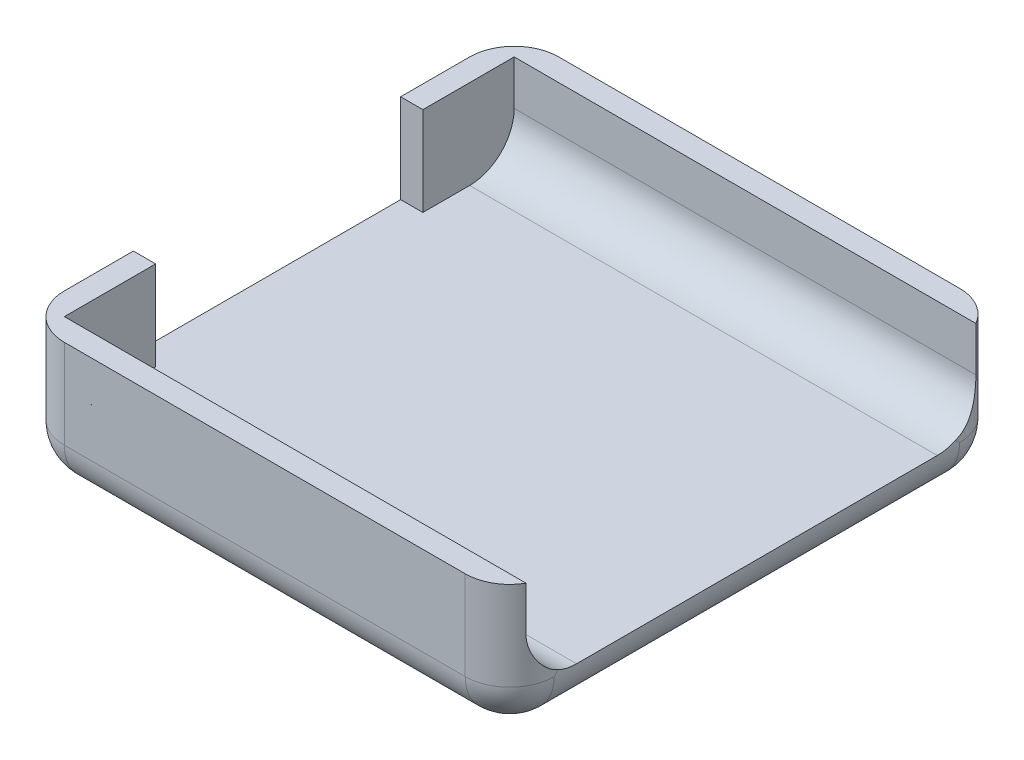
ISO-10303-21;
HEADER;
FILE_DESCRIPTION(('STEP AP214'),'2;1');
FILE_NAME('part.step','',(''),(''),'','','');
FILE_SCHEMA(('AUTOMOTIVE_DESIGN { 1 0 10303 214 1 1 1 1 }'));
ENDSEC;
DATA;
#1=APPLICATION_CONTEXT('core data for automotive mechanical design processes');
#2=APPLICATION_PROTOCOL_DEFINITION('international standard','automotive_design',2000,#1);
#3=PRODUCT_CONTEXT('',#1,'mechanical');
#4=PRODUCT('Part','Part','',(#3));
#5=PRODUCT_RELATED_PRODUCT_CATEGORY('part','',(#4));
#6=PRODUCT_DEFINITION_FORMATION('','',#4);
#7=PRODUCT_DEFINITION_CONTEXT('part definition',#1,'design');
#8=PRODUCT_DEFINITION('design','',#6,#7);
#9=PRODUCT_DEFINITION_SHAPE('','',#8);
#10=(LENGTH_UNIT() NAMED_UNIT(*) SI_UNIT(.MILLI.,.METRE.));
#11=(NAMED_UNIT(*) PLANE_ANGLE_UNIT() SI_UNIT($,.RADIAN.));
#12=(NAMED_UNIT(*) SI_UNIT($,.STERADIAN.) SOLID_ANGLE_UNIT());
#13=UNCERTAINTY_MEASURE_WITH_UNIT(LENGTH_MEASURE(1.E-05),#10,'distance_accuracy_value','');
#14=(GEOMETRIC_REPRESENTATION_CONTEXT(3) GLOBAL_UNCERTAINTY_ASSIGNED_CONTEXT((#13)) GLOBAL_UNIT_ASSIGNED_CONTEXT((#10,
#11,#12)) REPRESENTATION_CONTEXT('',''));
#15=CARTESIAN_POINT('',(0.,0.,0.));
#16=DIRECTION('',(0.,0.,1.));
#17=DIRECTION('',(1.,0.,0.));
#18=AXIS2_PLACEMENT_3D('',#15,#16,#17);
#19=CARTESIAN_POINT('',(-11.,6.,11.1));
#20=DIRECTION('',(1.,0.,0.));
#21=DIRECTION('',(0.,0.,-1.));
#22=AXIS2_PLACEMENT_3D('',#19,#20,#21);
#23=PLANE('',#22);
#24=DIRECTION('',(0.,-1.,0.));
#25=VECTOR('',#24,1.);
#26=CARTESIAN_POINT('',(-11.,2.,-6.));
#27=LINE('',#26,#25);
#28=CARTESIAN_POINT('',(-11.,6.,-6.));
#29=VERTEX_POINT('',#28);
#30=CARTESIAN_POINT('',(-11.,2.,-6.));
#31=VERTEX_POINT('',#30);
#32=EDGE_CURVE('E606',#29,#31,#27,.T.);
#33=ORIENTED_EDGE('',*,*,#32,.F.);
#34=DIRECTION('',(0.,0.,1.));
#35=VECTOR('',#34,1.);
#36=CARTESIAN_POINT('',(-11.,6.,11.1));
#37=LINE('',#36,#35);
#38=CARTESIAN_POINT('',(-11.,6.,-9.1));
#39=VERTEX_POINT('',#38);
#40=EDGE_CURVE('E544',#39,#29,#37,.T.);
#41=ORIENTED_EDGE('',*,*,#40,.F.);
#42=DIRECTION('',(0.,-1.,0.));
#43=VECTOR('',#42,1.);
#44=CARTESIAN_POINT('',(-11.,6.,-9.1));
#45=LINE('',#44,#43);
#46=CARTESIAN_POINT('',(-11.,2.,-9.1));
#47=VERTEX_POINT('',#46);
#48=EDGE_CURVE('E196',#39,#47,#45,.T.);
#49=ORIENTED_EDGE('',*,*,#48,.T.);
#50=DIRECTION('',(0.,0.,1.));
#51=VECTOR('',#50,1.);
#52=CARTESIAN_POINT('',(-11.,2.,11.1));
#53=LINE('',#52,#51);
#54=EDGE_CURVE('E516',#47,#31,#53,.T.);
#55=ORIENTED_EDGE('',*,*,#54,.T.);
#56=EDGE_LOOP('',(#33,#41,#49,#55));
#57=FACE_BOUND('',#56,.T.);
#58=ADVANCED_FACE('F39',(#57),#23,.F.);
#59=DIRECTION('',(0.,1.,0.));
#60=VECTOR('',#59,1.);
#61=CARTESIAN_POINT('',(-11.,2.,6.));
#62=LINE('',#61,#60);
#63=CARTESIAN_POINT('',(-11.,2.,6.));
#64=VERTEX_POINT('',#63);
#65=CARTESIAN_POINT('',(-11.,6.,6.));
#66=VERTEX_POINT('',#65);
#67=EDGE_CURVE('E618',#64,#66,#62,.T.);
#68=ORIENTED_EDGE('',*,*,#67,.F.);
#69=CARTESIAN_POINT('',(-11.,2.,9.1));
#70=VERTEX_POINT('',#69);
#71=EDGE_CURVE('E515',#64,#70,#53,.T.);
#72=ORIENTED_EDGE('',*,*,#71,.T.);
#73=DIRECTION('',(0.,-1.,0.));
#74=VECTOR('',#73,1.);
#75=CARTESIAN_POINT('',(-11.,6.,9.1));
#76=LINE('',#75,#74);
#77=CARTESIAN_POINT('',(-11.,6.,9.1));
#78=VERTEX_POINT('',#77);
#79=EDGE_CURVE('E518',#70,#78,#76,.F.);
#80=ORIENTED_EDGE('',*,*,#79,.T.);
#81=EDGE_CURVE('E192',#66,#78,#37,.T.);
#82=ORIENTED_EDGE('',*,*,#81,.F.);
#83=EDGE_LOOP('',(#68,#72,#80,#82));
#84=FACE_BOUND('',#83,.T.);
#85=ADVANCED_FACE('F328',(#84),#23,.F.);
#86=CARTESIAN_POINT('',(0.,6.,0.));
#87=DIRECTION('',(0.,-1.,0.));
#88=DIRECTION('',(0.,0.,-1.));
#89=AXIS2_PLACEMENT_3D('',#86,#87,#88);
#90=PLANE('',#89);
#91=DIRECTION('',(-1.,0.,0.));
#92=VECTOR('',#91,1.);
#93=CARTESIAN_POINT('',(-0.999999999999999,6.,-6.));
#94=LINE('',#93,#92);
#95=CARTESIAN_POINT('',(-10.,6.,-6.));
#96=VERTEX_POINT('',#95);
#97=EDGE_CURVE('E620',#96,#29,#94,.T.);
#98=ORIENTED_EDGE('',*,*,#97,.F.);
#99=DIRECTION('',(0.,0.,1.));
#100=VECTOR('',#99,1.);
#101=CARTESIAN_POINT('',(-10.,6.,10.1));
#102=LINE('',#101,#100);
#103=CARTESIAN_POINT('',(-10.,6.,-10.1));
#104=VERTEX_POINT('',#103);
#105=EDGE_CURVE('E632',#104,#96,#102,.T.);
#106=ORIENTED_EDGE('',*,*,#105,.F.);
#107=DIRECTION('',(-1.,0.,0.));
#108=VECTOR('',#107,1.);
#109=CARTESIAN_POINT('',(-10.,6.,-10.1));
#110=LINE('',#109,#108);
#111=CARTESIAN_POINT('',(10.7320508075689,6.,-10.1));
#112=VERTEX_POINT('',#111);
#113=EDGE_CURVE('E541',#112,#104,#110,.T.);
#114=ORIENTED_EDGE('',*,*,#113,.F.);
#115=CARTESIAN_POINT('',(9.,6.,-9.1));
#116=DIRECTION('',(0.,-1.,0.));
#117=DIRECTION('',(0.,0.,-1.));
#118=AXIS2_PLACEMENT_3D('',#115,#116,#117);
#119=CIRCLE('',#118,2.);
#120=CARTESIAN_POINT('',(9.,6.,-11.1));
#121=VERTEX_POINT('',#120);
#122=EDGE_CURVE('E195',#112,#121,#119,.F.);
#123=ORIENTED_EDGE('',*,*,#122,.T.);
#124=DIRECTION('',(-1.,0.,0.));
#125=VECTOR('',#124,1.);
#126=CARTESIAN_POINT('',(-11.,6.,-11.1));
#127=LINE('',#126,#125);
#128=CARTESIAN_POINT('',(-9.,6.,-11.1));
#129=VERTEX_POINT('',#128);
#130=EDGE_CURVE('E176',#121,#129,#127,.T.);
#131=ORIENTED_EDGE('',*,*,#130,.T.);
#132=CARTESIAN_POINT('',(-9.,6.,-9.1));
#133=DIRECTION('',(0.,-1.,0.));
#134=DIRECTION('',(0.,0.,-1.));
#135=AXIS2_PLACEMENT_3D('',#132,#133,#134);
#136=CIRCLE('',#135,2.);
#137=EDGE_CURVE('E189',#129,#39,#136,.F.);
#138=ORIENTED_EDGE('',*,*,#137,.T.);
#139=ORIENTED_EDGE('',*,*,#40,.T.);
#140=EDGE_LOOP('',(#98,#106,#114,#123,#131,#138,#139));
#141=FACE_BOUND('',#140,.T.);
#142=ADVANCED_FACE('F187',(#141),#90,.F.);
#143=CARTESIAN_POINT('',(-10.,2.,10.1));
#144=DIRECTION('',(-1.,0.,0.));
#145=DIRECTION('',(0.,0.,1.));
#146=AXIS2_PLACEMENT_3D('',#143,#144,#145);
#147=PLANE('',#146);
#148=ORIENTED_EDGE('',*,*,#105,.T.);
#149=DIRECTION('',(0.,-1.,0.));
#150=VECTOR('',#149,1.);
#151=CARTESIAN_POINT('',(-10.,2.,-6.));
#152=LINE('',#151,#150);
#153=CARTESIAN_POINT('',(-10.,2.,-6.));
#154=VERTEX_POINT('',#153);
#155=EDGE_CURVE('E216',#96,#154,#152,.T.);
#156=ORIENTED_EDGE('',*,*,#155,.T.);
#157=DIRECTION('',(0.,0.,1.));
#158=VECTOR('',#157,1.);
#159=CARTESIAN_POINT('',(-10.,2.,10.1));
#160=LINE('',#159,#158);
#161=CARTESIAN_POINT('',(-10.,2.,-8.09999999999999));
#162=VERTEX_POINT('',#161);
#163=EDGE_CURVE('E635',#162,#154,#160,.T.);
#164=ORIENTED_EDGE('',*,*,#163,.F.);
#165=CARTESIAN_POINT('',(-10.,4.,-8.09999999999999));
#166=DIRECTION('',(-1.,0.,0.));
#167=DIRECTION('',(0.,0.,1.));
#168=AXIS2_PLACEMENT_3D('',#165,#166,#167);
#169=CIRCLE('',#168,2.);
#170=CARTESIAN_POINT('',(-10.,4.,-10.1));
#171=VERTEX_POINT('',#170);
#172=EDGE_CURVE('E556',#162,#171,#169,.F.);
#173=ORIENTED_EDGE('',*,*,#172,.T.);
#174=DIRECTION('',(0.,1.,0.));
#175=VECTOR('',#174,1.);
#176=CARTESIAN_POINT('',(-10.,2.,-10.1));
#177=LINE('',#176,#175);
#178=EDGE_CURVE('E564',#171,#104,#177,.T.);
#179=ORIENTED_EDGE('',*,*,#178,.T.);
#180=EDGE_LOOP('',(#148,#156,#164,#173,#179));
#181=FACE_BOUND('',#180,.T.);
#182=ADVANCED_FACE('F323',(#181),#147,.F.);
#183=CARTESIAN_POINT('',(-10.,6.,6.));
#184=VERTEX_POINT('',#183);
#185=CARTESIAN_POINT('',(-10.,6.,10.1));
#186=VERTEX_POINT('',#185);
#187=EDGE_CURVE('E98',#184,#186,#102,.T.);
#188=ORIENTED_EDGE('',*,*,#187,.F.);
#189=DIRECTION('',(-1.,0.,0.));
#190=VECTOR('',#189,1.);
#191=CARTESIAN_POINT('',(-0.999999999999999,6.,6.));
#192=LINE('',#191,#190);
#193=EDGE_CURVE('E53',#184,#66,#192,.T.);
#194=ORIENTED_EDGE('',*,*,#193,.T.);
#195=ORIENTED_EDGE('',*,*,#81,.T.);
#196=CARTESIAN_POINT('',(-9.,6.,9.1));
#197=DIRECTION('',(0.,-1.,0.));
#198=DIRECTION('',(0.,0.,-1.));
#199=AXIS2_PLACEMENT_3D('',#196,#197,#198);
#200=CIRCLE('',#199,2.);
#201=CARTESIAN_POINT('',(-9.,6.,11.1));
#202=VERTEX_POINT('',#201);
#203=EDGE_CURVE('E199',#78,#202,#200,.F.);
#204=ORIENTED_EDGE('',*,*,#203,.T.);
#205=DIRECTION('',(1.,0.,0.));
#206=VECTOR('',#205,1.);
#207=CARTESIAN_POINT('',(-11.,6.,11.1));
#208=LINE('',#207,#206);
#209=CARTESIAN_POINT('',(9.,6.,11.1));
#210=VERTEX_POINT('',#209);
#211=EDGE_CURVE('E537',#202,#210,#208,.T.);
#212=ORIENTED_EDGE('',*,*,#211,.T.);
#213=CARTESIAN_POINT('',(9.,6.,9.1));
#214=DIRECTION('',(0.,-1.,0.));
#215=DIRECTION('',(0.,0.,-1.));
#216=AXIS2_PLACEMENT_3D('',#213,#214,#215);
#217=CIRCLE('',#216,2.);
#218=CARTESIAN_POINT('',(10.7320508075689,6.,10.1));
#219=VERTEX_POINT('',#218);
#220=EDGE_CURVE('E203',#210,#219,#217,.F.);
#221=ORIENTED_EDGE('',*,*,#220,.T.);
#222=DIRECTION('',(1.,0.,0.));
#223=VECTOR('',#222,1.);
#224=CARTESIAN_POINT('',(9.99999999999999,6.,10.1));
#225=LINE('',#224,#223);
#226=EDGE_CURVE('E501',#186,#219,#225,.T.);
#227=ORIENTED_EDGE('',*,*,#226,.F.);
#228=EDGE_LOOP('',(#188,#194,#195,#204,#212,#221,#227));
#229=FACE_BOUND('',#228,.T.);
#230=ADVANCED_FACE('F336',(#229),#90,.F.);
#231=CARTESIAN_POINT('',(-11.,6.,-11.1));
#232=DIRECTION('',(0.,0.,1.));
#233=DIRECTION('',(1.,0.,0.));
#234=AXIS2_PLACEMENT_3D('',#231,#232,#233);
#235=PLANE('',#234);
#236=ORIENTED_EDGE('',*,*,#130,.F.);
#237=DIRECTION('',(0.,-1.,0.));
#238=VECTOR('',#237,1.);
#239=CARTESIAN_POINT('',(9.,6.,-11.1));
#240=LINE('',#239,#238);
#241=CARTESIAN_POINT('',(9.,2.,-11.1));
#242=VERTEX_POINT('',#241);
#243=EDGE_CURVE('E62',#121,#242,#240,.T.);
#244=ORIENTED_EDGE('',*,*,#243,.T.);
#245=DIRECTION('',(-1.,0.,0.));
#246=VECTOR('',#245,1.);
#247=CARTESIAN_POINT('',(-11.,2.,-11.1));
#248=LINE('',#247,#246);
#249=CARTESIAN_POINT('',(-9.,2.,-11.1));
#250=VERTEX_POINT('',#249);
#251=EDGE_CURVE('E180',#242,#250,#248,.T.);
#252=ORIENTED_EDGE('',*,*,#251,.T.);
#253=DIRECTION('',(0.,-1.,0.));
#254=VECTOR('',#253,1.);
#255=CARTESIAN_POINT('',(-9.,6.,-11.1));
#256=LINE('',#255,#254);
#257=EDGE_CURVE('E173',#250,#129,#256,.F.);
#258=ORIENTED_EDGE('',*,*,#257,.T.);
#259=EDGE_LOOP('',(#236,#244,#252,#258));
#260=FACE_BOUND('',#259,.T.);
#261=ADVANCED_FACE('F174',(#260),#235,.F.);
#262=CARTESIAN_POINT('',(-11.,6.,11.1));
#263=DIRECTION('',(0.,0.,-1.));
#264=DIRECTION('',(-1.,0.,0.));
#265=AXIS2_PLACEMENT_3D('',#262,#263,#264);
#266=PLANE('',#265);
#267=DIRECTION('',(1.,0.,0.));
#268=VECTOR('',#267,1.);
#269=CARTESIAN_POINT('',(11.,2.,11.1));
#270=LINE('',#269,#268);
#271=CARTESIAN_POINT('',(-9.,2.,11.1));
#272=VERTEX_POINT('',#271);
#273=CARTESIAN_POINT('',(9.,2.,11.1));
#274=VERTEX_POINT('',#273);
#275=EDGE_CURVE('E531',#272,#274,#270,.T.);
#276=ORIENTED_EDGE('',*,*,#275,.T.);
#277=DIRECTION('',(0.,-1.,0.));
#278=VECTOR('',#277,1.);
#279=CARTESIAN_POINT('',(9.,6.,11.1));
#280=LINE('',#279,#278);
#281=EDGE_CURVE('E185',#274,#210,#280,.F.);
#282=ORIENTED_EDGE('',*,*,#281,.T.);
#283=ORIENTED_EDGE('',*,*,#211,.F.);
#284=DIRECTION('',(0.,-1.,0.));
#285=VECTOR('',#284,1.);
#286=CARTESIAN_POINT('',(-9.,6.,11.1));
#287=LINE('',#286,#285);
#288=EDGE_CURVE('E532',#202,#272,#287,.T.);
#289=ORIENTED_EDGE('',*,*,#288,.T.);
#290=EDGE_LOOP('',(#276,#282,#283,#289));
#291=FACE_BOUND('',#290,.T.);
#292=ADVANCED_FACE('F331',(#291),#266,.F.);
#293=CARTESIAN_POINT('',(0.,0.,0.));
#294=DIRECTION('',(0.,-1.,0.));
#295=DIRECTION('',(0.,0.,-1.));
#296=AXIS2_PLACEMENT_3D('',#293,#294,#295);
#297=PLANE('',#296);
#298=CARTESIAN_POINT('',(0.35,0.,0.));
#299=DIRECTION('',(0.,-1.,0.));
#300=DIRECTION('',(0.,0.,-1.));
#301=AXIS2_PLACEMENT_3D('',#298,#299,#300);
#302=CIRCLE('',#301,4.4);
#303=CARTESIAN_POINT('',(0.35,0.,-4.4));
#304=VERTEX_POINT('',#303);
#305=EDGE_CURVE('E11',#304,#304,#302,.F.);
#306=ORIENTED_EDGE('',*,*,#305,.T.);
#307=EDGE_LOOP('',(#306));
#308=FACE_BOUND('',#307,.T.);
#309=DIRECTION('',(1.,0.,0.));
#310=VECTOR('',#309,1.);
#311=CARTESIAN_POINT('',(-11.,0.,9.1));
#312=LINE('',#311,#310);
#313=CARTESIAN_POINT('',(9.,0.,9.1));
#314=VERTEX_POINT('',#313);
#315=CARTESIAN_POINT('',(-9.,0.,9.1));
#316=VERTEX_POINT('',#315);
#317=EDGE_CURVE('E528',#314,#316,#312,.F.);
#318=ORIENTED_EDGE('',*,*,#317,.T.);
#319=DIRECTION('',(0.,0.,1.));
#320=VECTOR('',#319,1.);
#321=CARTESIAN_POINT('',(-9.,0.,-11.1));
#322=LINE('',#321,#320);
#323=CARTESIAN_POINT('',(-9.,0.,-9.1));
#324=VERTEX_POINT('',#323);
#325=EDGE_CURVE('E527',#316,#324,#322,.F.);
#326=ORIENTED_EDGE('',*,*,#325,.T.);
#327=DIRECTION('',(-1.,0.,0.));
#328=VECTOR('',#327,1.);
#329=CARTESIAN_POINT('',(11.,0.,-9.1));
#330=LINE('',#329,#328);
#331=CARTESIAN_POINT('',(9.,0.,-9.1));
#332=VERTEX_POINT('',#331);
#333=EDGE_CURVE('E525',#324,#332,#330,.F.);
#334=ORIENTED_EDGE('',*,*,#333,.T.);
#335=DIRECTION('',(0.,0.,-1.));
#336=VECTOR('',#335,1.);
#337=CARTESIAN_POINT('',(9.,0.,11.1));
#338=LINE('',#337,#336);
#339=EDGE_CURVE('E524',#332,#314,#338,.F.);
#340=ORIENTED_EDGE('',*,*,#339,.T.);
#341=EDGE_LOOP('',(#318,#326,#334,#340));
#342=FACE_BOUND('',#341,.T.);
#343=ADVANCED_FACE('F345',(#308,#342),#297,.T.);
#344=CARTESIAN_POINT('',(9.99999999999999,2.,10.1));
#345=DIRECTION('',(0.,0.,1.));
#346=DIRECTION('',(1.,0.,0.));
#347=AXIS2_PLACEMENT_3D('',#344,#345,#346);
#348=PLANE('',#347);
#349=DIRECTION('',(0.,-1.,0.));
#350=VECTOR('',#349,1.);
#351=CARTESIAN_POINT('',(10.7320508075689,6.,10.1));
#352=LINE('',#351,#350);
#353=CARTESIAN_POINT('',(10.7320508075689,4.,10.1));
#354=VERTEX_POINT('',#353);
#355=EDGE_CURVE('E496',#219,#354,#352,.T.);
#356=ORIENTED_EDGE('',*,*,#355,.T.);
#357=DIRECTION('',(1.,0.,0.));
#358=VECTOR('',#357,1.);
#359=CARTESIAN_POINT('',(-10.,4.,10.1));
#360=LINE('',#359,#358);
#361=CARTESIAN_POINT('',(-10.,4.,10.1));
#362=VERTEX_POINT('',#361);
#363=EDGE_CURVE('E497',#354,#362,#360,.F.);
#364=ORIENTED_EDGE('',*,*,#363,.T.);
#365=DIRECTION('',(0.,1.,0.));
#366=VECTOR('',#365,1.);
#367=CARTESIAN_POINT('',(-10.,2.,10.1));
#368=LINE('',#367,#366);
#369=EDGE_CURVE('E193',#362,#186,#368,.T.);
#370=ORIENTED_EDGE('',*,*,#369,.T.);
#371=ORIENTED_EDGE('',*,*,#226,.T.);
#372=EDGE_LOOP('',(#356,#364,#370,#371));
#373=FACE_BOUND('',#372,.T.);
#374=ADVANCED_FACE('F430',(#373),#348,.F.);
#375=CARTESIAN_POINT('',(-10.,2.,-10.1));
#376=DIRECTION('',(0.,0.,-1.));
#377=DIRECTION('',(-1.,0.,0.));
#378=AXIS2_PLACEMENT_3D('',#375,#376,#377);
#379=PLANE('',#378);
#380=ORIENTED_EDGE('',*,*,#178,.F.);
#381=DIRECTION('',(-1.,0.,0.));
#382=VECTOR('',#381,1.);
#383=CARTESIAN_POINT('',(11.,4.,-10.1));
#384=LINE('',#383,#382);
#385=CARTESIAN_POINT('',(10.7320508075689,4.,-10.1));
#386=VERTEX_POINT('',#385);
#387=EDGE_CURVE('E503',#171,#386,#384,.F.);
#388=ORIENTED_EDGE('',*,*,#387,.T.);
#389=DIRECTION('',(0.,-1.,0.));
#390=VECTOR('',#389,1.);
#391=CARTESIAN_POINT('',(10.7320508075689,2.,-10.1));
#392=LINE('',#391,#390);
#393=EDGE_CURVE('E557',#386,#112,#392,.F.);
#394=ORIENTED_EDGE('',*,*,#393,.T.);
#395=ORIENTED_EDGE('',*,*,#113,.T.);
#396=EDGE_LOOP('',(#380,#388,#394,#395));
#397=FACE_BOUND('',#396,.T.);
#398=ADVANCED_FACE('F448',(#397),#379,.F.);
#399=CARTESIAN_POINT('',(0.,2.,0.));
#400=DIRECTION('',(0.,-1.,0.));
#401=DIRECTION('',(0.,0.,-1.));
#402=AXIS2_PLACEMENT_3D('',#399,#400,#401);
#403=PLANE('',#402);
#404=ORIENTED_EDGE('',*,*,#163,.T.);
#405=DIRECTION('',(-1.,0.,0.));
#406=VECTOR('',#405,1.);
#407=CARTESIAN_POINT('',(-0.999999999999999,2.,-6.));
#408=LINE('',#407,#406);
#409=EDGE_CURVE('E616',#154,#31,#408,.T.);
#410=ORIENTED_EDGE('',*,*,#409,.T.);
#411=DIRECTION('',(0.,0.,1.));
#412=VECTOR('',#411,1.);
#413=CARTESIAN_POINT('',(-11.,2.,-6.));
#414=LINE('',#413,#412);
#415=EDGE_CURVE('E613',#31,#64,#414,.T.);
#416=ORIENTED_EDGE('',*,*,#415,.T.);
#417=DIRECTION('',(-1.,0.,0.));
#418=VECTOR('',#417,1.);
#419=CARTESIAN_POINT('',(-0.999999999999999,2.,6.));
#420=LINE('',#419,#418);
#421=CARTESIAN_POINT('',(-10.,2.,6.));
#422=VERTEX_POINT('',#421);
#423=EDGE_CURVE('E624',#422,#64,#420,.T.);
#424=ORIENTED_EDGE('',*,*,#423,.F.);
#425=CARTESIAN_POINT('',(-10.,2.,8.1));
#426=VERTEX_POINT('',#425);
#427=EDGE_CURVE('E574',#422,#426,#160,.T.);
#428=ORIENTED_EDGE('',*,*,#427,.T.);
#429=DIRECTION('',(1.,0.,0.));
#430=VECTOR('',#429,1.);
#431=CARTESIAN_POINT('',(11.,2.,8.1));
#432=LINE('',#431,#430);
#433=CARTESIAN_POINT('',(11.,2.,8.1));
#434=VERTEX_POINT('',#433);
#435=EDGE_CURVE('E552',#426,#434,#432,.T.);
#436=ORIENTED_EDGE('',*,*,#435,.T.);
#437=DIRECTION('',(0.,0.,1.));
#438=VECTOR('',#437,1.);
#439=CARTESIAN_POINT('',(11.,2.,11.1));
#440=LINE('',#439,#438);
#441=CARTESIAN_POINT('',(11.,2.,-8.09999999999999));
#442=VERTEX_POINT('',#441);
#443=EDGE_CURVE('E548',#442,#434,#440,.T.);
#444=ORIENTED_EDGE('',*,*,#443,.F.);
#445=DIRECTION('',(-1.,0.,0.));
#446=VECTOR('',#445,1.);
#447=CARTESIAN_POINT('',(-10.,2.,-8.09999999999999));
#448=LINE('',#447,#446);
#449=EDGE_CURVE('E555',#442,#162,#448,.T.);
#450=ORIENTED_EDGE('',*,*,#449,.T.);
#451=EDGE_LOOP('',(#404,#410,#416,#424,#428,#436,#444,#450));
#452=FACE_BOUND('',#451,.T.);
#453=ADVANCED_FACE('F325',(#452),#403,.F.);
#454=ORIENTED_EDGE('',*,*,#427,.F.);
#455=DIRECTION('',(0.,1.,0.));
#456=VECTOR('',#455,1.);
#457=CARTESIAN_POINT('',(-10.,2.,6.));
#458=LINE('',#457,#456);
#459=EDGE_CURVE('E625',#422,#184,#458,.T.);
#460=ORIENTED_EDGE('',*,*,#459,.T.);
#461=ORIENTED_EDGE('',*,*,#187,.T.);
#462=ORIENTED_EDGE('',*,*,#369,.F.);
#463=CARTESIAN_POINT('',(-10.,4.,8.1));
#464=DIRECTION('',(-1.,0.,0.));
#465=DIRECTION('',(0.,0.,1.));
#466=AXIS2_PLACEMENT_3D('',#463,#464,#465);
#467=CIRCLE('',#466,2.);
#468=EDGE_CURVE('E509',#362,#426,#467,.F.);
#469=ORIENTED_EDGE('',*,*,#468,.T.);
#470=EDGE_LOOP('',(#454,#460,#461,#462,#469));
#471=FACE_BOUND('',#470,.T.);
#472=ADVANCED_FACE('F320',(#471),#147,.F.);
#473=CARTESIAN_POINT('',(-9.,6.,-9.1));
#474=DIRECTION('',(0.,-1.,0.));
#475=DIRECTION('',(0.,0.,-1.));
#476=AXIS2_PLACEMENT_3D('',#473,#474,#475);
#477=CYLINDRICAL_SURFACE('',#476,2.);
#478=ORIENTED_EDGE('',*,*,#137,.F.);
#479=ORIENTED_EDGE('',*,*,#257,.F.);
#480=CARTESIAN_POINT('',(-9.,2.,-9.1));
#481=DIRECTION('',(0.,-1.,0.));
#482=DIRECTION('',(0.,0.,-1.));
#483=AXIS2_PLACEMENT_3D('',#480,#481,#482);
#484=CIRCLE('',#483,2.);
#485=EDGE_CURVE('E598',#47,#250,#484,.T.);
#486=ORIENTED_EDGE('',*,*,#485,.F.);
#487=ORIENTED_EDGE('',*,*,#48,.F.);
#488=EDGE_LOOP('',(#478,#479,#486,#487));
#489=FACE_BOUND('',#488,.T.);
#490=ADVANCED_FACE('F200',(#489),#477,.T.);
#491=CARTESIAN_POINT('',(-9.,2.,11.1));
#492=DIRECTION('',(0.,0.,-1.));
#493=DIRECTION('',(-1.,0.,0.));
#494=AXIS2_PLACEMENT_3D('',#491,#492,#493);
#495=CYLINDRICAL_SURFACE('',#494,2.);
#496=CARTESIAN_POINT('',(-9.,2.,9.1));
#497=DIRECTION('',(0.,0.,1.));
#498=DIRECTION('',(1.,0.,0.));
#499=AXIS2_PLACEMENT_3D('',#496,#497,#498);
#500=CIRCLE('',#499,2.);
#501=EDGE_CURVE('E595',#70,#316,#500,.T.);
#502=ORIENTED_EDGE('',*,*,#501,.F.);
#503=ORIENTED_EDGE('',*,*,#71,.F.);
#504=ORIENTED_EDGE('',*,*,#415,.F.);
#505=ORIENTED_EDGE('',*,*,#54,.F.);
#506=CARTESIAN_POINT('',(-9.,2.,-9.1));
#507=DIRECTION('',(0.,0.,-1.));
#508=DIRECTION('',(-1.,0.,0.));
#509=AXIS2_PLACEMENT_3D('',#506,#507,#508);
#510=CIRCLE('',#509,2.);
#511=EDGE_CURVE('E600',#324,#47,#510,.T.);
#512=ORIENTED_EDGE('',*,*,#511,.F.);
#513=ORIENTED_EDGE('',*,*,#325,.F.);
#514=EDGE_LOOP('',(#502,#503,#504,#505,#512,#513));
#515=FACE_BOUND('',#514,.T.);
#516=ADVANCED_FACE('F315',(#515),#495,.T.);
#517=CARTESIAN_POINT('',(-9.,6.,9.1));
#518=DIRECTION('',(0.,-1.,0.));
#519=DIRECTION('',(0.,0.,-1.));
#520=AXIS2_PLACEMENT_3D('',#517,#518,#519);
#521=CYLINDRICAL_SURFACE('',#520,2.);
#522=ORIENTED_EDGE('',*,*,#203,.F.);
#523=ORIENTED_EDGE('',*,*,#79,.F.);
#524=CARTESIAN_POINT('',(-9.,2.,9.1));
#525=DIRECTION('',(0.,-1.,0.));
#526=DIRECTION('',(0.,0.,-1.));
#527=AXIS2_PLACEMENT_3D('',#524,#525,#526);
#528=CIRCLE('',#527,2.);
#529=EDGE_CURVE('E593',#272,#70,#528,.T.);
#530=ORIENTED_EDGE('',*,*,#529,.F.);
#531=ORIENTED_EDGE('',*,*,#288,.F.);
#532=EDGE_LOOP('',(#522,#523,#530,#531));
#533=FACE_BOUND('',#532,.T.);
#534=ADVANCED_FACE('F308',(#533),#521,.T.);
#535=CARTESIAN_POINT('',(-9.,2.,-9.1));
#536=DIRECTION('',(-1.,0.,0.));
#537=DIRECTION('',(0.,0.,1.));
#538=AXIS2_PLACEMENT_3D('',#535,#536,#537);
#539=SPHERICAL_SURFACE('',#538,2.);
#540=ORIENTED_EDGE('',*,*,#511,.T.);
#541=ORIENTED_EDGE('',*,*,#485,.T.);
#542=CARTESIAN_POINT('',(-9.,2.,-9.1));
#543=DIRECTION('',(-1.,0.,0.));
#544=DIRECTION('',(0.,0.,1.));
#545=AXIS2_PLACEMENT_3D('',#542,#543,#544);
#546=CIRCLE('',#545,2.);
#547=EDGE_CURVE('E586',#324,#250,#546,.F.);
#548=ORIENTED_EDGE('',*,*,#547,.F.);
#549=EDGE_LOOP('',(#540,#541,#548));
#550=FACE_BOUND('',#549,.T.);
#551=ADVANCED_FACE('F302',(#550),#539,.T.);
#552=CARTESIAN_POINT('',(-9.,2.,9.1));
#553=DIRECTION('',(-1.,0.,0.));
#554=DIRECTION('',(0.,0.,1.));
#555=AXIS2_PLACEMENT_3D('',#552,#553,#554);
#556=SPHERICAL_SURFACE('',#555,2.);
#557=ORIENTED_EDGE('',*,*,#529,.T.);
#558=ORIENTED_EDGE('',*,*,#501,.T.);
#559=CARTESIAN_POINT('',(-9.,2.,9.1));
#560=DIRECTION('',(-1.,0.,0.));
#561=DIRECTION('',(0.,0.,1.));
#562=AXIS2_PLACEMENT_3D('',#559,#560,#561);
#563=CIRCLE('',#562,2.);
#564=EDGE_CURVE('E582',#272,#316,#563,.F.);
#565=ORIENTED_EDGE('',*,*,#564,.F.);
#566=EDGE_LOOP('',(#557,#558,#565));
#567=FACE_BOUND('',#566,.T.);
#568=ADVANCED_FACE('F297',(#567),#556,.T.);
#569=CARTESIAN_POINT('',(-11.,2.,-9.1));
#570=DIRECTION('',(1.,0.,0.));
#571=DIRECTION('',(0.,0.,-1.));
#572=AXIS2_PLACEMENT_3D('',#569,#570,#571);
#573=CYLINDRICAL_SURFACE('',#572,2.);
#574=ORIENTED_EDGE('',*,*,#547,.T.);
#575=ORIENTED_EDGE('',*,*,#251,.F.);
#576=CARTESIAN_POINT('',(9.,2.,-9.1));
#577=DIRECTION('',(1.,0.,0.));
#578=DIRECTION('',(0.,0.,-1.));
#579=AXIS2_PLACEMENT_3D('',#576,#577,#578);
#580=CIRCLE('',#579,2.);
#581=EDGE_CURVE('E585',#332,#242,#580,.T.);
#582=ORIENTED_EDGE('',*,*,#581,.F.);
#583=ORIENTED_EDGE('',*,*,#333,.F.);
#584=EDGE_LOOP('',(#574,#575,#582,#583));
#585=FACE_BOUND('',#584,.T.);
#586=ADVANCED_FACE('F298',(#585),#573,.T.);
#587=CARTESIAN_POINT('',(-11.,2.,9.1));
#588=DIRECTION('',(-1.,0.,0.));
#589=DIRECTION('',(0.,0.,1.));
#590=AXIS2_PLACEMENT_3D('',#587,#588,#589);
#591=CYLINDRICAL_SURFACE('',#590,2.);
#592=ORIENTED_EDGE('',*,*,#564,.T.);
#593=ORIENTED_EDGE('',*,*,#317,.F.);
#594=CARTESIAN_POINT('',(9.,2.,9.1));
#595=DIRECTION('',(1.,0.,0.));
#596=DIRECTION('',(0.,0.,-1.));
#597=AXIS2_PLACEMENT_3D('',#594,#595,#596);
#598=CIRCLE('',#597,2.);
#599=EDGE_CURVE('E578',#274,#314,#598,.T.);
#600=ORIENTED_EDGE('',*,*,#599,.F.);
#601=ORIENTED_EDGE('',*,*,#275,.F.);
#602=EDGE_LOOP('',(#592,#593,#600,#601));
#603=FACE_BOUND('',#602,.T.);
#604=ADVANCED_FACE('F291',(#603),#591,.T.);
#605=CARTESIAN_POINT('',(9.,2.,-9.1));
#606=DIRECTION('',(0.,0.,-1.));
#607=DIRECTION('',(-1.,0.,0.));
#608=AXIS2_PLACEMENT_3D('',#605,#606,#607);
#609=SPHERICAL_SURFACE('',#608,2.);
#610=CARTESIAN_POINT('',(9.,2.,-9.1));
#611=DIRECTION('',(0.,0.,-1.));
#612=DIRECTION('',(-1.,0.,0.));
#613=AXIS2_PLACEMENT_3D('',#610,#611,#612);
#614=CIRCLE('',#613,2.);
#615=CARTESIAN_POINT('',(11.,2.,-9.1));
#616=VERTEX_POINT('',#615);
#617=EDGE_CURVE('E268',#332,#616,#614,.F.);
#618=ORIENTED_EDGE('',*,*,#617,.F.);
#619=ORIENTED_EDGE('',*,*,#581,.T.);
#620=CARTESIAN_POINT('',(9.,2.,-9.1));
#621=DIRECTION('',(0.,-1.,0.));
#622=DIRECTION('',(0.,0.,-1.));
#623=AXIS2_PLACEMENT_3D('',#620,#621,#622);
#624=CIRCLE('',#623,2.);
#625=EDGE_CURVE('E86',#616,#242,#624,.F.);
#626=ORIENTED_EDGE('',*,*,#625,.F.);
#627=EDGE_LOOP('',(#618,#619,#626));
#628=FACE_BOUND('',#627,.T.);
#629=ADVANCED_FACE('F290',(#628),#609,.T.);
#630=CARTESIAN_POINT('',(9.,2.,9.1));
#631=DIRECTION('',(1.,0.,0.));
#632=DIRECTION('',(0.,0.,-1.));
#633=AXIS2_PLACEMENT_3D('',#630,#631,#632);
#634=SPHERICAL_SURFACE('',#633,2.);
#635=CARTESIAN_POINT('',(9.,2.,9.1));
#636=DIRECTION('',(0.,-1.,0.));
#637=DIRECTION('',(0.,0.,-1.));
#638=AXIS2_PLACEMENT_3D('',#635,#636,#637);
#639=CIRCLE('',#638,2.);
#640=CARTESIAN_POINT('',(11.,2.,9.1));
#641=VERTEX_POINT('',#640);
#642=EDGE_CURVE('E278',#274,#641,#639,.F.);
#643=ORIENTED_EDGE('',*,*,#642,.F.);
#644=ORIENTED_EDGE('',*,*,#599,.T.);
#645=CARTESIAN_POINT('',(9.,2.,9.1));
#646=DIRECTION('',(0.,0.,1.));
#647=DIRECTION('',(1.,0.,0.));
#648=AXIS2_PLACEMENT_3D('',#645,#646,#647);
#649=CIRCLE('',#648,2.);
#650=EDGE_CURVE('E261',#641,#314,#649,.F.);
#651=ORIENTED_EDGE('',*,*,#650,.F.);
#652=EDGE_LOOP('',(#643,#644,#651));
#653=FACE_BOUND('',#652,.T.);
#654=ADVANCED_FACE('F282',(#653),#634,.T.);
#655=CARTESIAN_POINT('',(9.,6.,9.1));
#656=DIRECTION('',(0.,-1.,0.));
#657=DIRECTION('',(0.,0.,-1.));
#658=AXIS2_PLACEMENT_3D('',#655,#656,#657);
#659=CYLINDRICAL_SURFACE('',#658,2.);
#660=CARTESIAN_POINT('',(10.9921413018651,2.1771243444677,8.9228756555323));
#661=CARTESIAN_POINT('',(10.996236850495,2.19785901874959,8.96883937856044));
#662=CARTESIAN_POINT('',(10.9986501842268,2.22039991246175,9.01410829964845));
#663=CARTESIAN_POINT('',(11.0004868028149,2.26883902588533,9.10280505457347));
#664=CARTESIAN_POINT('',(10.9999139161348,2.29473290538849,9.14623517381395));
#665=CARTESIAN_POINT('',(10.996176458039,2.34945152785447,9.23057487564213));
#666=CARTESIAN_POINT('',(10.9930332132878,2.37825044976156,9.27150223163657));
#667=CARTESIAN_POINT('',(10.9845961603612,2.43871125967936,9.35094843705326));
#668=CARTESIAN_POINT('',(10.9793017144196,2.47037399455824,9.38946656830177));
#669=CARTESIAN_POINT('',(10.960882432998,2.5689853262127,9.50070323009242));
#670=CARTESIAN_POINT('',(10.9451916191636,2.63986508937262,9.56957583729261));
#671=CARTESIAN_POINT('',(10.9102798591065,2.79058875725233,9.69594741208142));
#672=CARTESIAN_POINT('',(10.8910484823157,2.87045887022528,9.75341170274045));
#673=CARTESIAN_POINT('',(10.8500736692483,3.04783131335305,9.86223220791242));
#674=CARTESIAN_POINT('',(10.8283068752149,3.14629851459999,9.91201705397737));
#675=CARTESIAN_POINT('',(10.7892333864489,3.35066415732796,9.99485210946569));
#676=CARTESIAN_POINT('',(10.7719153118788,3.45654273850367,10.0279452298313));
#677=CARTESIAN_POINT('',(10.750271880559,3.63586867023354,10.0679174636568));
#678=CARTESIAN_POINT('',(10.7435253189019,3.70790255497362,10.0799015043628));
#679=CARTESIAN_POINT('',(10.7366876715315,3.81687644412742,10.0919355005661));
#680=CARTESIAN_POINT('',(10.7349553815917,3.85340264753188,10.0949565330929));
#681=CARTESIAN_POINT('',(10.73263419093,3.92661659687401,10.0989899448158));
#682=CARTESIAN_POINT('',(10.7320457541188,3.96330440230904,10.1000015090386));
#683=CARTESIAN_POINT('',(10.7320508075689,4.,10.1));
#684=B_SPLINE_CURVE_WITH_KNOTS('',3,(#660,#661,#662,#663,#664,#665,#666,#667,#668,#669,#670,
#671,#672,#673,#674,#675,#676,#677,#678,#679,#680,#681,#682,#683),.UNSPECIFIED.,.F.,.F.,(4,2,2,
2,2,2,2,2,2,2,2,4),(0.,0.151666695564561,0.303138995734613,0.453367107463802,0.603639789832957,
0.90251327484491,1.20228176143518,1.5381866094878,1.87322345785697,2.09267224506773,
2.20268090551557,2.31273417269934),.UNSPECIFIED.);
#685=CARTESIAN_POINT('',(10.9921413018651,2.1771243444677,8.9228756555323));
#686=VERTEX_POINT('',#685);
#687=EDGE_CURVE('E275',#354,#686,#684,.F.);
#688=ORIENTED_EDGE('',*,*,#687,.F.);
#689=ORIENTED_EDGE('',*,*,#355,.F.);
#690=ORIENTED_EDGE('',*,*,#220,.F.);
#691=ORIENTED_EDGE('',*,*,#281,.F.);
#692=ORIENTED_EDGE('',*,*,#642,.T.);
#693=CARTESIAN_POINT('',(9.,2.,9.1));
#694=DIRECTION('',(0.,0.707106781186547,0.707106781186547));
#695=DIRECTION('',(0.,-0.707106781186547,0.707106781186547));
#696=AXIS2_PLACEMENT_3D('',#693,#694,#695);
#697=ELLIPSE('',#696,2.82842712474619,2.);
#698=EDGE_CURVE('E258',#686,#641,#697,.F.);
#699=ORIENTED_EDGE('',*,*,#698,.F.);
#700=EDGE_LOOP('',(#688,#689,#690,#691,#692,#699));
#701=FACE_BOUND('',#700,.T.);
#702=ADVANCED_FACE('F250',(#701),#659,.T.);
#703=CARTESIAN_POINT('',(0.,4.,8.1));
#704=DIRECTION('',(-1.,0.,0.));
#705=DIRECTION('',(0.,0.,1.));
#706=AXIS2_PLACEMENT_3D('',#703,#704,#705);
#707=CYLINDRICAL_SURFACE('',#706,2.);
#708=ORIENTED_EDGE('',*,*,#363,.F.);
#709=ORIENTED_EDGE('',*,*,#687,.T.);
#710=CARTESIAN_POINT('',(11.,2.,8.1));
#711=CARTESIAN_POINT('',(10.9999817966539,1.99999354724047,8.15646896756199));
#712=CARTESIAN_POINT('',(10.9999994074307,2.0023912226692,8.2129384169372));
#713=CARTESIAN_POINT('',(10.9999748787588,2.01195263448665,8.32550670957099));
#714=CARTESIAN_POINT('',(10.999932703371,2.01911923624187,8.38160530953002));
#715=CARTESIAN_POINT('',(10.9996593610908,2.03800818226048,8.49200935450489));
#716=CARTESIAN_POINT('',(10.9994315399642,2.04964796268016,8.54632897573337));
#717=CARTESIAN_POINT('',(10.9985504073155,2.0773967104592,8.65377953826732));
#718=CARTESIAN_POINT('',(10.9978973851652,2.0935026340937,8.70691126258263));
#719=CARTESIAN_POINT('',(10.9963327490961,2.12144289336573,8.78693749550393));
#720=CARTESIAN_POINT('',(10.9956881599894,2.13171168775857,8.8143930930728));
#721=CARTESIAN_POINT('',(10.9941310951834,2.15349404502453,8.86894893454236));
#722=CARTESIAN_POINT('',(10.993217366662,2.16501326652304,8.89604688303022));
#723=CARTESIAN_POINT('',(10.9921413018651,2.1771243444677,8.9228756555323));
#724=B_SPLINE_CURVE_WITH_KNOTS('',3,(#710,#711,#712,#713,#714,#715,#716,#717,#718,#719,#720,
#721,#722,#723),.UNSPECIFIED.,.F.,.F.,(4,2,2,2,2,2,4),(0.,0.169357509793954,0.33881686851445,
0.505288003158942,0.671645963580558,0.759580611797682,0.847931237886468),.UNSPECIFIED.);
#725=EDGE_CURVE('E255',#434,#686,#724,.T.);
#726=ORIENTED_EDGE('',*,*,#725,.F.);
#727=ORIENTED_EDGE('',*,*,#435,.F.);
#728=ORIENTED_EDGE('',*,*,#468,.F.);
#729=EDGE_LOOP('',(#708,#709,#726,#727,#728));
#730=FACE_BOUND('',#729,.T.);
#731=ADVANCED_FACE('F238',(#730),#707,.F.);
#732=CARTESIAN_POINT('',(9.,6.,-9.1));
#733=DIRECTION('',(0.,-1.,0.));
#734=DIRECTION('',(0.,0.,-1.));
#735=AXIS2_PLACEMENT_3D('',#732,#733,#734);
#736=CYLINDRICAL_SURFACE('',#735,2.);
#737=CARTESIAN_POINT('',(9.,2.,-9.1));
#738=DIRECTION('',(0.,-0.707106781186547,0.707106781186547));
#739=DIRECTION('',(0.,-0.707106781186547,-0.707106781186547));
#740=AXIS2_PLACEMENT_3D('',#737,#738,#739);
#741=ELLIPSE('',#740,2.82842712474619,2.);
#742=CARTESIAN_POINT('',(10.9921413018651,2.17712434446771,-8.92287565553231));
#743=VERTEX_POINT('',#742);
#744=EDGE_CURVE('E270',#616,#743,#741,.T.);
#745=ORIENTED_EDGE('',*,*,#744,.F.);
#746=ORIENTED_EDGE('',*,*,#625,.T.);
#747=ORIENTED_EDGE('',*,*,#243,.F.);
#748=ORIENTED_EDGE('',*,*,#122,.F.);
#749=ORIENTED_EDGE('',*,*,#393,.F.);
#750=CARTESIAN_POINT('',(10.7320508075689,4.,-10.1));
#751=CARTESIAN_POINT('',(10.7320237178578,3.94645160487867,-10.1000099020265));
#752=CARTESIAN_POINT('',(10.7332918537236,3.89291592615685,-10.0978498438998));
#753=CARTESIAN_POINT('',(10.7382142173798,3.7863430732424,-10.0892700729631));
#754=CARTESIAN_POINT('',(10.7418663467883,3.73330550222354,-10.0828541061073));
#755=CARTESIAN_POINT('',(10.7513219484809,3.62845066870783,-10.0658982159464));
#756=CARTESIAN_POINT('',(10.7571111794138,3.57662769021938,-10.0553855671306));
#757=CARTESIAN_POINT('',(10.7704856301971,3.47419841359246,-10.0303664728046));
#758=CARTESIAN_POINT('',(10.7780711874378,3.42359234598638,-10.0158592769456));
#759=CARTESIAN_POINT('',(10.802847349804,3.27437988146431,-9.96665670992374));
#760=CARTESIAN_POINT('',(10.8221018917188,3.17795288757261,-9.9262100418114));
#761=CARTESIAN_POINT('',(10.8623679783827,2.99263118300329,-9.83092891763189));
#762=CARTESIAN_POINT('',(10.8833844522101,2.90375910575591,-9.77605311411785));
#763=CARTESIAN_POINT('',(10.9249325456131,2.72777082397979,-9.64736661077389));
#764=CARTESIAN_POINT('',(10.9452557481362,2.64150983026266,-9.57230800180974));
#765=CARTESIAN_POINT('',(10.9779333580926,2.48256737022355,-9.40781226323665));
#766=CARTESIAN_POINT('',(10.9903192099803,2.40983314026738,-9.31843364612433));
#767=CARTESIAN_POINT('',(10.9991305050079,2.31299576023793,-9.17578785798317));
#768=CARTESIAN_POINT('',(11.0004445836627,2.28279392431532,-9.12688306753376));
#769=CARTESIAN_POINT('',(10.9992848357667,2.22665635865023,-9.02659146043892));
#770=CARTESIAN_POINT('',(10.9968026582464,2.2007301735263,-8.97519941333242));
#771=CARTESIAN_POINT('',(10.9921413018651,2.17712434446771,-8.92287565553231));
#772=B_SPLINE_CURVE_WITH_KNOTS('',3,(#750,#751,#752,#753,#754,#755,#756,#757,#758,#759,#760,
#761,#762,#763,#764,#765,#766,#767,#768,#769,#770,#771),.UNSPECIFIED.,.F.,.F.,(4,2,2,2,2,2,2,2,
2,2,4),(0.,0.160565954713904,0.32099077011812,0.480365286634599,0.639769761030244,
0.957291671602681,1.27573356604999,1.62242574426234,1.9677358415376,2.13991584357466,
2.31247515075145),.UNSPECIFIED.);
#773=EDGE_CURVE('E220',#743,#386,#772,.F.);
#774=ORIENTED_EDGE('',*,*,#773,.F.);
#775=EDGE_LOOP('',(#745,#746,#747,#748,#749,#774));
#776=FACE_BOUND('',#775,.T.);
#777=ADVANCED_FACE('F235',(#776),#736,.T.);
#778=CARTESIAN_POINT('',(9.,2.,11.1));
#779=DIRECTION('',(0.,0.,1.));
#780=DIRECTION('',(1.,0.,0.));
#781=AXIS2_PLACEMENT_3D('',#778,#779,#780);
#782=CYLINDRICAL_SURFACE('',#781,2.);
#783=ORIENTED_EDGE('',*,*,#617,.T.);
#784=ORIENTED_EDGE('',*,*,#744,.T.);
#785=CARTESIAN_POINT('',(10.9921413018651,2.17712434446771,-8.92287565553231));
#786=CARTESIAN_POINT('',(10.9941917948374,2.15389714757956,-8.87143942687484));
#787=CARTESIAN_POINT('',(10.9956673971439,2.13285392401687,-8.81900032789987));
#788=CARTESIAN_POINT('',(10.9978228252096,2.09525979197218,-8.71249276407795));
#789=CARTESIAN_POINT('',(10.9985022977594,2.07871087992763,-8.6584235869368));
#790=CARTESIAN_POINT('',(10.9994102715288,2.05049939335391,-8.55003452798572));
#791=CARTESIAN_POINT('',(10.9996464502912,2.0387564402206,-8.49573556026335));
#792=CARTESIAN_POINT('',(10.9999244478244,2.01983221634421,-8.38637632577549));
#793=CARTESIAN_POINT('',(10.9999663886047,2.01264808445137,-8.331316558711));
#794=CARTESIAN_POINT('',(10.9999947246512,2.0051839178337,-8.24686390348348));
#795=CARTESIAN_POINT('',(10.9999979850741,2.00324572671792,-8.21760855139212));
#796=CARTESIAN_POINT('',(11.000000116228,2.00065073138256,-8.15890348682887));
#797=CARTESIAN_POINT('',(10.9999989662855,1.99999998370211,-8.1294535065696));
#798=CARTESIAN_POINT('',(11.,2.,-8.09999999999999));
#799=B_SPLINE_CURVE_WITH_KNOTS('',3,(#785,#786,#787,#788,#789,#790,#791,#792,#793,#794,#795,
#796,#797,#798),.UNSPECIFIED.,.F.,.F.,(4,2,2,2,2,2,4),(0.,0.169363579669616,0.338802270459713,
0.505278309514333,0.67164976337591,0.759583358523319,0.847929646550036),.UNSPECIFIED.);
#800=EDGE_CURVE('E206',#442,#743,#799,.F.);
#801=ORIENTED_EDGE('',*,*,#800,.F.);
#802=ORIENTED_EDGE('',*,*,#443,.T.);
#803=DIRECTION('',(0.,0.,1.));
#804=VECTOR('',#803,1.);
#805=CARTESIAN_POINT('',(11.,2.,8.375));
#806=LINE('',#805,#804);
#807=CARTESIAN_POINT('',(11.,2.,8.65));
#808=VERTEX_POINT('',#807);
#809=EDGE_CURVE('E259',#434,#808,#806,.T.);
#810=ORIENTED_EDGE('',*,*,#809,.T.);
#811=ORIENTED_EDGE('',*,*,#809,.F.);
#812=ORIENTED_EDGE('',*,*,#725,.T.);
#813=ORIENTED_EDGE('',*,*,#698,.T.);
#814=ORIENTED_EDGE('',*,*,#650,.T.);
#815=ORIENTED_EDGE('',*,*,#339,.F.);
#816=EDGE_LOOP('',(#783,#784,#801,#802,#810,#811,#812,#813,#814,#815));
#817=FACE_BOUND('',#816,.T.);
#818=ADVANCED_FACE('F226',(#817),#782,.T.);
#819=CARTESIAN_POINT('',(0.,4.,-8.09999999999999));
#820=DIRECTION('',(1.,0.,0.));
#821=DIRECTION('',(0.,0.,-1.));
#822=AXIS2_PLACEMENT_3D('',#819,#820,#821);
#823=CYLINDRICAL_SURFACE('',#822,2.);
#824=ORIENTED_EDGE('',*,*,#773,.T.);
#825=ORIENTED_EDGE('',*,*,#387,.F.);
#826=ORIENTED_EDGE('',*,*,#172,.F.);
#827=ORIENTED_EDGE('',*,*,#449,.F.);
#828=ORIENTED_EDGE('',*,*,#800,.T.);
#829=EDGE_LOOP('',(#824,#825,#826,#827,#828));
#830=FACE_BOUND('',#829,.T.);
#831=ADVANCED_FACE('F233',(#830),#823,.F.);
#832=CARTESIAN_POINT('',(-0.999999999999999,2.,-6.));
#833=DIRECTION('',(0.,0.,-1.));
#834=DIRECTION('',(-1.,0.,0.));
#835=AXIS2_PLACEMENT_3D('',#832,#833,#834);
#836=PLANE('',#835);
#837=ORIENTED_EDGE('',*,*,#97,.T.);
#838=ORIENTED_EDGE('',*,*,#32,.T.);
#839=ORIENTED_EDGE('',*,*,#409,.F.);
#840=ORIENTED_EDGE('',*,*,#155,.F.);
#841=EDGE_LOOP('',(#837,#838,#839,#840));
#842=FACE_BOUND('',#841,.T.);
#843=ADVANCED_FACE('F245',(#842),#836,.F.);
#844=CARTESIAN_POINT('',(-0.999999999999999,2.,6.));
#845=DIRECTION('',(0.,0.,1.));
#846=DIRECTION('',(1.,0.,0.));
#847=AXIS2_PLACEMENT_3D('',#844,#845,#846);
#848=PLANE('',#847);
#849=ORIENTED_EDGE('',*,*,#423,.T.);
#850=ORIENTED_EDGE('',*,*,#67,.T.);
#851=ORIENTED_EDGE('',*,*,#193,.F.);
#852=ORIENTED_EDGE('',*,*,#459,.F.);
#853=EDGE_LOOP('',(#849,#850,#851,#852));
#854=FACE_BOUND('',#853,.T.);
#855=ADVANCED_FACE('F386',(#854),#848,.F.);
#856=CARTESIAN_POINT('',(0.35,-6.,0.));
#857=DIRECTION('',(0.,1.,0.));
#858=DIRECTION('',(0.,0.,1.));
#859=AXIS2_PLACEMENT_3D('',#856,#857,#858);
#860=CYLINDRICAL_SURFACE('',#859,2.4);
#861=CARTESIAN_POINT('',(0.35,-2.,0.));
#862=DIRECTION('',(0.,-1.,0.));
#863=DIRECTION('',(0.,0.,-1.));
#864=AXIS2_PLACEMENT_3D('',#861,#862,#863);
#865=CIRCLE('',#864,2.4);
#866=CARTESIAN_POINT('',(0.35,-2.,-2.4));
#867=VERTEX_POINT('',#866);
#868=EDGE_CURVE('E50',#867,#867,#865,.T.);
#869=ORIENTED_EDGE('',*,*,#868,.T.);
#870=EDGE_LOOP('',(#869));
#871=FACE_BOUND('',#870,.T.);
#872=CARTESIAN_POINT('',(0.35,-6.,0.));
#873=DIRECTION('',(0.,-1.,0.));
#874=DIRECTION('',(0.,0.,-1.));
#875=AXIS2_PLACEMENT_3D('',#872,#873,#874);
#876=CIRCLE('',#875,2.4);
#877=CARTESIAN_POINT('',(0.35,-6.,-2.4));
#878=VERTEX_POINT('',#877);
#879=EDGE_CURVE('E610',#878,#878,#876,.T.);
#880=ORIENTED_EDGE('',*,*,#879,.F.);
#881=EDGE_LOOP('',(#880));
#882=FACE_BOUND('',#881,.T.);
#883=ADVANCED_FACE('F392',(#871,#882),#860,.T.);
#884=CARTESIAN_POINT('',(0.35,-6.,0.));
#885=DIRECTION('',(0.,-1.,0.));
#886=DIRECTION('',(0.,0.,-1.));
#887=AXIS2_PLACEMENT_3D('',#884,#885,#886);
#888=PLANE('',#887);
#889=ORIENTED_EDGE('',*,*,#879,.T.);
#890=EDGE_LOOP('',(#889));
#891=FACE_BOUND('',#890,.T.);
#892=ADVANCED_FACE('F401',(#891),#888,.T.);
#893=CARTESIAN_POINT('',(0.35,-2.,0.));
#894=DIRECTION('',(0.,-1.,0.));
#895=DIRECTION('',(0.,0.,-1.));
#896=AXIS2_PLACEMENT_3D('',#893,#894,#895);
#897=TOROIDAL_SURFACE('',#896,4.4,2.);
#898=ORIENTED_EDGE('',*,*,#305,.F.);
#899=EDGE_LOOP('',(#898));
#900=FACE_BOUND('',#899,.T.);
#901=ORIENTED_EDGE('',*,*,#868,.F.);
#902=EDGE_LOOP('',(#901));
#903=FACE_BOUND('',#902,.T.);
#904=ADVANCED_FACE('F41',(#900,#903),#897,.F.);
#905=CLOSED_SHELL('',(#58,#85,#142,#182,#230,#261,#292,#343,#374,#398,#453,#472,#490,#516,#534,
#551,#568,#586,#604,#629,#654,#702,#731,#777,#818,#831,#843,#855,#883,#892,#904));
#906=MANIFOLD_SOLID_BREP('B2',#905);
#907=ADVANCED_BREP_SHAPE_REPRESENTATION('',(#18,#906),#14);
#908=SHAPE_DEFINITION_REPRESENTATION(#9,#907);
ENDSEC;
END-ISO-10303-21;
